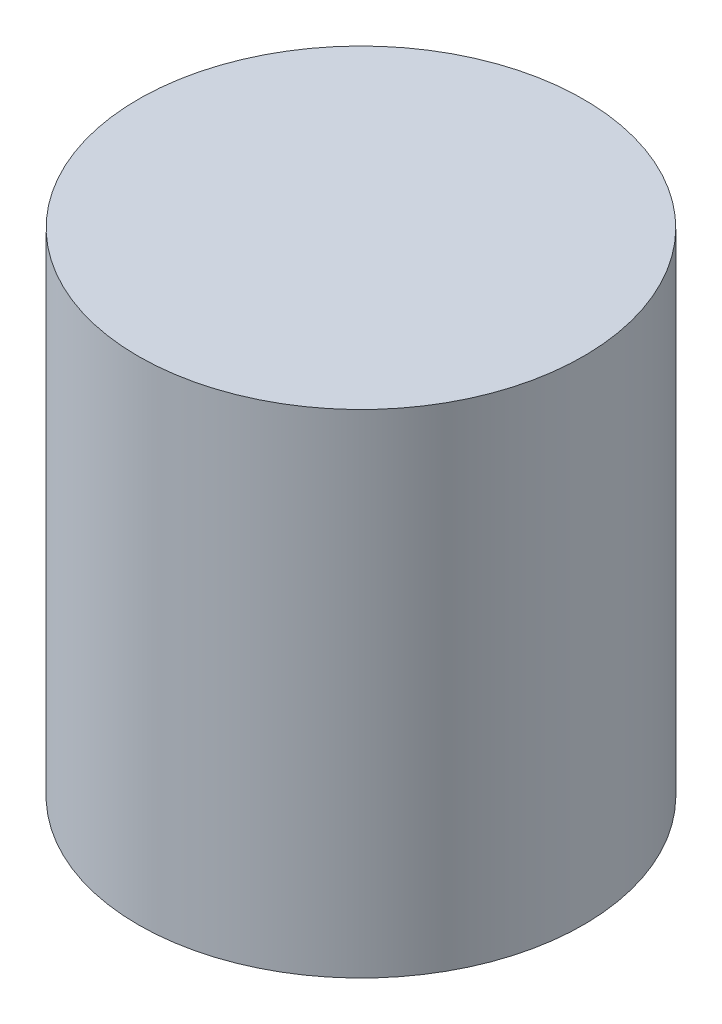
ISO-10303-21;
HEADER;
FILE_DESCRIPTION(('STEP AP214'),'2;1');
FILE_NAME('part.step','',(''),(''),'','','');
FILE_SCHEMA(('AUTOMOTIVE_DESIGN { 1 0 10303 214 1 1 1 1 }'));
ENDSEC;
DATA;
#1=APPLICATION_CONTEXT('core data for automotive mechanical design processes');
#2=APPLICATION_PROTOCOL_DEFINITION('international standard','automotive_design',2000,#1);
#3=PRODUCT_CONTEXT('',#1,'mechanical');
#4=PRODUCT('Part','Part','',(#3));
#5=PRODUCT_RELATED_PRODUCT_CATEGORY('part','',(#4));
#6=PRODUCT_DEFINITION_FORMATION('','',#4);
#7=PRODUCT_DEFINITION_CONTEXT('part definition',#1,'design');
#8=PRODUCT_DEFINITION('design','',#6,#7);
#9=PRODUCT_DEFINITION_SHAPE('','',#8);
#10=(LENGTH_UNIT() NAMED_UNIT(*) SI_UNIT(.MILLI.,.METRE.));
#11=(NAMED_UNIT(*) PLANE_ANGLE_UNIT() SI_UNIT($,.RADIAN.));
#12=(NAMED_UNIT(*) SI_UNIT($,.STERADIAN.) SOLID_ANGLE_UNIT());
#13=UNCERTAINTY_MEASURE_WITH_UNIT(LENGTH_MEASURE(1.E-05),#10,'distance_accuracy_value','');
#14=(GEOMETRIC_REPRESENTATION_CONTEXT(3) GLOBAL_UNCERTAINTY_ASSIGNED_CONTEXT((#13)) GLOBAL_UNIT_ASSIGNED_CONTEXT((#10,
#11,#12)) REPRESENTATION_CONTEXT('',''));
#15=CARTESIAN_POINT('',(0.,0.,0.));
#16=DIRECTION('',(0.,0.,1.));
#17=DIRECTION('',(1.,0.,0.));
#18=AXIS2_PLACEMENT_3D('',#15,#16,#17);
#19=CARTESIAN_POINT('',(0.,177.8,0.));
#20=DIRECTION('',(0.,-1.,0.));
#21=DIRECTION('',(0.,0.,-1.));
#22=AXIS2_PLACEMENT_3D('',#19,#20,#21);
#23=CYLINDRICAL_SURFACE('',#22,80.391);
#24=CARTESIAN_POINT('',(0.,177.8,0.));
#25=DIRECTION('',(0.,1.,0.));
#26=DIRECTION('',(0.,0.,1.));
#27=AXIS2_PLACEMENT_3D('',#24,#25,#26);
#28=CIRCLE('',#27,80.391);
#29=CARTESIAN_POINT('',(0.,177.8,80.391));
#30=VERTEX_POINT('',#29);
#31=EDGE_CURVE('E10',#30,#30,#28,.T.);
#32=ORIENTED_EDGE('',*,*,#31,.F.);
#33=EDGE_LOOP('',(#32));
#34=FACE_BOUND('',#33,.T.);
#35=CARTESIAN_POINT('',(0.,0.,0.));
#36=DIRECTION('',(0.,1.,0.));
#37=DIRECTION('',(0.,0.,1.));
#38=AXIS2_PLACEMENT_3D('',#35,#36,#37);
#39=CIRCLE('',#38,80.391);
#40=CARTESIAN_POINT('',(0.,0.,80.391));
#41=VERTEX_POINT('',#40);
#42=EDGE_CURVE('E34',#41,#41,#39,.T.);
#43=ORIENTED_EDGE('',*,*,#42,.T.);
#44=EDGE_LOOP('',(#43));
#45=FACE_BOUND('',#44,.T.);
#46=ADVANCED_FACE('F31',(#34,#45),#23,.T.);
#47=CARTESIAN_POINT('',(0.,177.8,0.));
#48=DIRECTION('',(0.,1.,0.));
#49=DIRECTION('',(0.,0.,1.));
#50=AXIS2_PLACEMENT_3D('',#47,#48,#49);
#51=PLANE('',#50);
#52=ORIENTED_EDGE('',*,*,#31,.T.);
#53=EDGE_LOOP('',(#52));
#54=FACE_BOUND('',#53,.T.);
#55=ADVANCED_FACE('F46',(#54),#51,.T.);
#56=CARTESIAN_POINT('',(0.,0.,0.));
#57=DIRECTION('',(0.,1.,0.));
#58=DIRECTION('',(0.,0.,1.));
#59=AXIS2_PLACEMENT_3D('',#56,#57,#58);
#60=PLANE('',#59);
#61=ORIENTED_EDGE('',*,*,#42,.F.);
#62=EDGE_LOOP('',(#61));
#63=FACE_BOUND('',#62,.T.);
#64=ADVANCED_FACE('F44',(#63),#60,.F.);
#65=CLOSED_SHELL('',(#46,#55,#64));
#66=MANIFOLD_SOLID_BREP('B2',#65);
#67=ADVANCED_BREP_SHAPE_REPRESENTATION('',(#18,#66),#14);
#68=SHAPE_DEFINITION_REPRESENTATION(#9,#67);
ENDSEC;
END-ISO-10303-21;
